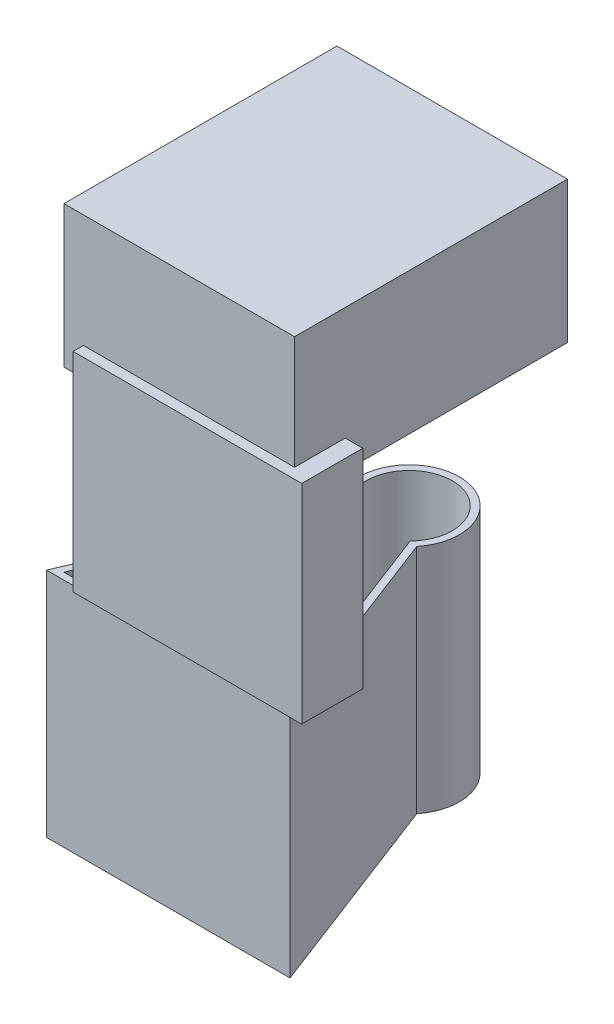
ISO-10303-21;
HEADER;
FILE_DESCRIPTION(('STEP AP214'),'2;1');
FILE_NAME('part.step','',(''),(''),'','','');
FILE_SCHEMA(('AUTOMOTIVE_DESIGN { 1 0 10303 214 1 1 1 1 }'));
ENDSEC;
DATA;
#1=APPLICATION_CONTEXT('core data for automotive mechanical design processes');
#2=APPLICATION_PROTOCOL_DEFINITION('international standard','automotive_design',2000,#1);
#3=PRODUCT_CONTEXT('',#1,'mechanical');
#4=PRODUCT('Part','Part','',(#3));
#5=PRODUCT_RELATED_PRODUCT_CATEGORY('part','',(#4));
#6=PRODUCT_DEFINITION_FORMATION('','',#4);
#7=PRODUCT_DEFINITION_CONTEXT('part definition',#1,'design');
#8=PRODUCT_DEFINITION('design','',#6,#7);
#9=PRODUCT_DEFINITION_SHAPE('','',#8);
#10=(LENGTH_UNIT() NAMED_UNIT(*) SI_UNIT(.MILLI.,.METRE.));
#11=(NAMED_UNIT(*) PLANE_ANGLE_UNIT() SI_UNIT($,.RADIAN.));
#12=(NAMED_UNIT(*) SI_UNIT($,.STERADIAN.) SOLID_ANGLE_UNIT());
#13=UNCERTAINTY_MEASURE_WITH_UNIT(LENGTH_MEASURE(1.E-05),#10,'distance_accuracy_value','');
#14=(GEOMETRIC_REPRESENTATION_CONTEXT(3) GLOBAL_UNCERTAINTY_ASSIGNED_CONTEXT((#13)) GLOBAL_UNIT_ASSIGNED_CONTEXT((#10,
#11,#12)) REPRESENTATION_CONTEXT('',''));
#15=CARTESIAN_POINT('',(0.,0.,0.));
#16=DIRECTION('',(0.,0.,1.));
#17=DIRECTION('',(1.,0.,0.));
#18=AXIS2_PLACEMENT_3D('',#15,#16,#17);
#19=CARTESIAN_POINT('',(-4.95391724093577,84.6392011698009,-49.3310687734821));
#20=DIRECTION('',(0.,-1.,0.));
#21=DIRECTION('',(0.,0.,-1.));
#22=AXIS2_PLACEMENT_3D('',#19,#20,#21);
#23=PLANE('',#22);
#24=DIRECTION('',(1.,0.,0.));
#25=VECTOR('',#24,1.);
#26=CARTESIAN_POINT('',(-4.95391724093577,84.6392011698009,37.3619784885693));
#27=LINE('',#26,#25);
#28=CARTESIAN_POINT('',(-50.8757468461296,84.6392011698009,37.3619784885693));
#29=VERTEX_POINT('',#28);
#30=CARTESIAN_POINT('',(-39.9174700103799,84.6392011698009,37.3619784885693));
#31=VERTEX_POINT('',#30);
#32=EDGE_CURVE('E359',#29,#31,#27,.T.);
#33=ORIENTED_EDGE('',*,*,#32,.T.);
#34=DIRECTION('',(0.,0.,-1.));
#35=VECTOR('',#34,1.);
#36=CARTESIAN_POINT('',(-39.9174700103799,84.6392011698009,-49.3310687734821));
#37=LINE('',#36,#35);
#38=CARTESIAN_POINT('',(-39.9174700103799,84.6392011698009,34.8219784885693));
#39=VERTEX_POINT('',#38);
#40=EDGE_CURVE('E299',#31,#39,#37,.T.);
#41=ORIENTED_EDGE('',*,*,#40,.T.);
#42=DIRECTION('',(1.,0.,0.));
#43=VECTOR('',#42,1.);
#44=CARTESIAN_POINT('',(-47.0317721679365,84.6392011698009,34.8219784885693));
#45=LINE('',#44,#43);
#46=CARTESIAN_POINT('',(-47.0317721679365,84.6392011698009,34.8219784885693));
#47=VERTEX_POINT('',#46);
#48=EDGE_CURVE('E393',#47,#39,#45,.T.);
#49=ORIENTED_EDGE('',*,*,#48,.F.);
#50=DIRECTION('',(-0.392153889503199,0.,0.919899628735392));
#51=VECTOR('',#50,1.);
#52=CARTESIAN_POINT('',(-15.9828122331645,84.6392011698009,-38.011486845156));
#53=LINE('',#52,#51);
#54=CARTESIAN_POINT('',(-39.9174700103799,84.6392011698009,18.1335199812764));
#55=VERTEX_POINT('',#54);
#56=EDGE_CURVE('E432',#55,#47,#53,.T.);
#57=ORIENTED_EDGE('',*,*,#56,.F.);
#58=CARTESIAN_POINT('',(-39.9174700103799,84.6392011698009,16.302076599942));
#59=VERTEX_POINT('',#58);
#60=EDGE_CURVE('E303',#55,#59,#37,.T.);
#61=ORIENTED_EDGE('',*,*,#60,.T.);
#62=DIRECTION('',(1.,0.,0.));
#63=VECTOR('',#62,1.);
#64=CARTESIAN_POINT('',(-4.95391724093577,84.6392011698009,16.302076599942));
#65=LINE('',#64,#63);
#66=CARTESIAN_POINT('',(-39.136724347527,84.6392011698009,16.302076599942));
#67=VERTEX_POINT('',#66);
#68=EDGE_CURVE('E309',#59,#67,#65,.T.);
#69=ORIENTED_EDGE('',*,*,#68,.T.);
#70=CARTESIAN_POINT('',(-15.9828122331645,84.6392011698009,-38.011486845156));
#71=VERTEX_POINT('',#70);
#72=EDGE_CURVE('E367',#71,#67,#53,.T.);
#73=ORIENTED_EDGE('',*,*,#72,.F.);
#74=CARTESIAN_POINT('',(-4.95391724093577,84.6392011698009,-49.3310687734821));
#75=DIRECTION('',(0.,1.,0.));
#76=DIRECTION('',(0.,0.,-1.));
#77=AXIS2_PLACEMENT_3D('',#74,#75,#76);
#78=CIRCLE('',#77,15.8040962975329);
#79=CARTESIAN_POINT('',(6.40171575912086,84.6392011698009,-38.339296443702));
#80=VERTEX_POINT('',#79);
#81=EDGE_CURVE('E333',#80,#71,#78,.T.);
#82=ORIENTED_EDGE('',*,*,#81,.F.);
#83=DIRECTION('',(-0.358251499245831,0.,-0.933625119246539));
#84=VECTOR('',#83,1.);
#85=CARTESIAN_POINT('',(34.4752282331372,84.6392011698009,34.8219784885693));
#86=LINE('',#85,#84);
#87=CARTESIAN_POINT('',(27.3687542526161,84.6392011698009,16.302076599942));
#88=VERTEX_POINT('',#87);
#89=EDGE_CURVE('E396',#88,#80,#86,.T.);
#90=ORIENTED_EDGE('',*,*,#89,.F.);
#91=CARTESIAN_POINT('',(30.0893322958138,84.6392011698009,16.302076599942));
#92=VERTEX_POINT('',#91);
#93=EDGE_CURVE('E313',#88,#92,#65,.T.);
#94=ORIENTED_EDGE('',*,*,#93,.T.);
#95=DIRECTION('',(-0.358251499245831,0.,-0.933625119246539));
#96=VECTOR('',#95,1.);
#97=CARTESIAN_POINT('',(3.63924799229749,84.6392011698009,-52.628446130421));
#98=LINE('',#97,#96);
#99=CARTESIAN_POINT('',(9.32395183839091,84.6392011698009,-37.8137633799985));
#100=VERTEX_POINT('',#99);
#101=EDGE_CURVE('E355',#92,#100,#98,.T.);
#102=ORIENTED_EDGE('',*,*,#101,.T.);
#103=CARTESIAN_POINT('',(-4.95391724093576,84.6392011698009,-49.3310687734812));
#104=DIRECTION('',(0.,-1.,0.));
#105=DIRECTION('',(0.,0.,-1.));
#106=AXIS2_PLACEMENT_3D('',#103,#104,#105);
#107=CIRCLE('',#106,18.3440962975323);
#108=CARTESIAN_POINT('',(-18.965674377796,84.6392011698009,-37.491451764862));
#109=VERTEX_POINT('',#108);
#110=EDGE_CURVE('E350',#100,#109,#107,.F.);
#111=ORIENTED_EDGE('',*,*,#110,.T.);
#112=DIRECTION('',(-0.392153889503199,0.,0.919899628735392));
#113=VECTOR('',#112,1.);
#114=CARTESIAN_POINT('',(-12.5398311952169,84.6392011698009,-52.5649494814214));
#115=LINE('',#114,#113);
#116=EDGE_CURVE('E356',#109,#29,#115,.T.);
#117=ORIENTED_EDGE('',*,*,#116,.T.);
#118=EDGE_LOOP('',(#33,#41,#49,#57,#61,#69,#73,#82,#90,#94,#102,#111,#117));
#119=FACE_BOUND('',#118,.T.);
#120=ADVANCED_FACE('F48',(#119),#23,.F.);
#121=CARTESIAN_POINT('',(-4.95391724093576,0.,-49.3310687734812));
#122=DIRECTION('',(0.,-1.,0.));
#123=DIRECTION('',(0.,0.,-1.));
#124=AXIS2_PLACEMENT_3D('',#121,#122,#123);
#125=PLANE('',#124);
#126=CARTESIAN_POINT('',(-4.95391724093576,0.,-49.3310687734812));
#127=DIRECTION('',(0.,1.,0.));
#128=DIRECTION('',(0.,0.,-1.));
#129=AXIS2_PLACEMENT_3D('',#126,#127,#128);
#130=CIRCLE('',#129,15.8040962975323);
#131=CARTESIAN_POINT('',(6.40171575912086,0.,-38.339296443702));
#132=VERTEX_POINT('',#131);
#133=CARTESIAN_POINT('',(-15.9828122331645,0.,-38.011486845156));
#134=VERTEX_POINT('',#133);
#135=EDGE_CURVE('E318',#132,#134,#130,.T.);
#136=ORIENTED_EDGE('',*,*,#135,.T.);
#137=DIRECTION('',(-0.392153889503199,0.,0.919899628735392));
#138=VECTOR('',#137,1.);
#139=CARTESIAN_POINT('',(-15.9828122331645,0.,-38.011486845156));
#140=LINE('',#139,#138);
#141=CARTESIAN_POINT('',(-47.0317721679365,0.,34.8219784885693));
#142=VERTEX_POINT('',#141);
#143=EDGE_CURVE('E322',#134,#142,#140,.T.);
#144=ORIENTED_EDGE('',*,*,#143,.T.);
#145=DIRECTION('',(1.,0.,0.));
#146=VECTOR('',#145,1.);
#147=CARTESIAN_POINT('',(-47.0317721679365,0.,34.8219784885693));
#148=LINE('',#147,#146);
#149=CARTESIAN_POINT('',(34.4752282331372,0.,34.8219784885693));
#150=VERTEX_POINT('',#149);
#151=EDGE_CURVE('E375',#142,#150,#148,.T.);
#152=ORIENTED_EDGE('',*,*,#151,.T.);
#153=DIRECTION('',(-0.358251499245831,0.,-0.933625119246539));
#154=VECTOR('',#153,1.);
#155=CARTESIAN_POINT('',(34.4752282331372,0.,34.8219784885693));
#156=LINE('',#155,#154);
#157=EDGE_CURVE('E380',#150,#132,#156,.T.);
#158=ORIENTED_EDGE('',*,*,#157,.T.);
#159=EDGE_LOOP('',(#136,#144,#152,#158));
#160=FACE_BOUND('',#159,.T.);
#161=CARTESIAN_POINT('',(-4.95391724093576,0.,-49.3310687734812));
#162=DIRECTION('',(0.,-1.,0.));
#163=DIRECTION('',(0.,0.,-1.));
#164=AXIS2_PLACEMENT_3D('',#161,#162,#163);
#165=CIRCLE('',#164,18.3440962975323);
#166=CARTESIAN_POINT('',(9.32395183839091,0.,-37.8137633799985));
#167=VERTEX_POINT('',#166);
#168=CARTESIAN_POINT('',(-18.965674377796,0.,-37.491451764862));
#169=VERTEX_POINT('',#168);
#170=EDGE_CURVE('E363',#167,#169,#165,.F.);
#171=ORIENTED_EDGE('',*,*,#170,.F.);
#172=DIRECTION('',(-0.358251499245831,0.,-0.933625119246539));
#173=VECTOR('',#172,1.);
#174=CARTESIAN_POINT('',(3.63924799229779,0.,-52.6284461304202));
#175=LINE('',#174,#173);
#176=CARTESIAN_POINT('',(38.1704574391258,0.,37.3619784885693));
#177=VERTEX_POINT('',#176);
#178=EDGE_CURVE('E366',#177,#167,#175,.T.);
#179=ORIENTED_EDGE('',*,*,#178,.F.);
#180=DIRECTION('',(1.,0.,0.));
#181=VECTOR('',#180,1.);
#182=CARTESIAN_POINT('',(-4.95391724093576,0.,37.3619784885693));
#183=LINE('',#182,#181);
#184=CARTESIAN_POINT('',(-50.8757468461296,0.,37.3619784885693));
#185=VERTEX_POINT('',#184);
#186=EDGE_CURVE('E369',#185,#177,#183,.T.);
#187=ORIENTED_EDGE('',*,*,#186,.F.);
#188=DIRECTION('',(-0.392153889503199,0.,0.919899628735392));
#189=VECTOR('',#188,1.);
#190=CARTESIAN_POINT('',(-12.5398311952173,0.,-52.5649494814207));
#191=LINE('',#190,#189);
#192=EDGE_CURVE('E343',#169,#185,#191,.T.);
#193=ORIENTED_EDGE('',*,*,#192,.F.);
#194=EDGE_LOOP('',(#171,#179,#187,#193));
#195=FACE_BOUND('',#194,.T.);
#196=ADVANCED_FACE('F457',(#160,#195),#125,.T.);
#197=CARTESIAN_POINT('',(-4.95391724093576,0.,-49.3310687734812));
#198=DIRECTION('',(0.,1.,0.));
#199=DIRECTION('',(0.,0.,1.));
#200=AXIS2_PLACEMENT_3D('',#197,#198,#199);
#201=CYLINDRICAL_SURFACE('',#200,18.3440962975323);
#202=DIRECTION('',(0.,1.,0.));
#203=VECTOR('',#202,1.);
#204=CARTESIAN_POINT('',(-18.965674377796,0.,-37.491451764862));
#205=LINE('',#204,#203);
#206=EDGE_CURVE('E340',#169,#109,#205,.T.);
#207=ORIENTED_EDGE('',*,*,#206,.T.);
#208=ORIENTED_EDGE('',*,*,#110,.F.);
#209=DIRECTION('',(0.,1.,0.));
#210=VECTOR('',#209,1.);
#211=CARTESIAN_POINT('',(9.32395183839091,0.,-37.8137633799985));
#212=LINE('',#211,#210);
#213=EDGE_CURVE('E342',#167,#100,#212,.T.);
#214=ORIENTED_EDGE('',*,*,#213,.F.);
#215=ORIENTED_EDGE('',*,*,#170,.T.);
#216=EDGE_LOOP('',(#207,#208,#214,#215));
#217=FACE_BOUND('',#216,.T.);
#218=ADVANCED_FACE('F493',(#217),#201,.T.);
#219=CARTESIAN_POINT('',(20.7749449934221,0.,-7.97178121840763));
#220=DIRECTION('',(-0.933625119246539,0.,0.358251499245831));
#221=DIRECTION('',(0.358251499245831,0.,0.933625119246539));
#222=AXIS2_PLACEMENT_3D('',#219,#220,#221);
#223=PLANE('',#222);
#224=ORIENTED_EDGE('',*,*,#101,.F.);
#225=DIRECTION('',(0.,-1.,0.));
#226=VECTOR('',#225,1.);
#227=CARTESIAN_POINT('',(30.0893322958138,0.,16.302076599942));
#228=LINE('',#227,#226);
#229=CARTESIAN_POINT('',(30.0893322958138,83.8,16.302076599942));
#230=VERTEX_POINT('',#229);
#231=EDGE_CURVE('E315',#92,#230,#228,.T.);
#232=ORIENTED_EDGE('',*,*,#231,.T.);
#233=DIRECTION('',(-0.358251499245831,0.,-0.933625119246539));
#234=VECTOR('',#233,1.);
#235=CARTESIAN_POINT('',(20.7749449934221,83.8,-7.97178121840763));
#236=LINE('',#235,#234);
#237=CARTESIAN_POINT('',(38.1704574391258,83.8,37.3619784885693));
#238=VERTEX_POINT('',#237);
#239=EDGE_CURVE('E297',#238,#230,#236,.T.);
#240=ORIENTED_EDGE('',*,*,#239,.F.);
#241=DIRECTION('',(0.,1.,0.));
#242=VECTOR('',#241,1.);
#243=CARTESIAN_POINT('',(38.1704574391258,0.,37.3619784885693));
#244=LINE('',#243,#242);
#245=EDGE_CURVE('E347',#177,#238,#244,.T.);
#246=ORIENTED_EDGE('',*,*,#245,.F.);
#247=ORIENTED_EDGE('',*,*,#178,.T.);
#248=ORIENTED_EDGE('',*,*,#213,.T.);
#249=EDGE_LOOP('',(#224,#232,#240,#246,#247,#248));
#250=FACE_BOUND('',#249,.T.);
#251=ADVANCED_FACE('F473',(#250),#223,.F.);
#252=CARTESIAN_POINT('',(-29.573793786131,0.,-12.6073300807178));
#253=DIRECTION('',(0.919899628735392,0.,0.392153889503199));
#254=DIRECTION('',(0.392153889503199,0.,-0.919899628735392));
#255=AXIS2_PLACEMENT_3D('',#252,#253,#254);
#256=PLANE('',#255);
#257=DIRECTION('',(0.,1.,0.));
#258=VECTOR('',#257,1.);
#259=CARTESIAN_POINT('',(-50.8757468461296,0.,37.3619784885693));
#260=LINE('',#259,#258);
#261=EDGE_CURVE('E346',#185,#29,#260,.T.);
#262=ORIENTED_EDGE('',*,*,#261,.T.);
#263=ORIENTED_EDGE('',*,*,#116,.F.);
#264=ORIENTED_EDGE('',*,*,#206,.F.);
#265=ORIENTED_EDGE('',*,*,#192,.T.);
#266=EDGE_LOOP('',(#262,#263,#264,#265));
#267=FACE_BOUND('',#266,.T.);
#268=ADVANCED_FACE('F486',(#267),#256,.F.);
#269=CARTESIAN_POINT('',(0.,0.,37.3619784885693));
#270=DIRECTION('',(0.,0.,-1.));
#271=DIRECTION('',(-1.,0.,0.));
#272=AXIS2_PLACEMENT_3D('',#269,#270,#271);
#273=PLANE('',#272);
#274=DIRECTION('',(1.,0.,0.));
#275=VECTOR('',#274,1.);
#276=CARTESIAN_POINT('',(0.,83.8,37.3619784885693));
#277=LINE('',#276,#275);
#278=CARTESIAN_POINT('',(-39.9174700103799,83.8,37.3619784885693));
#279=VERTEX_POINT('',#278);
#280=EDGE_CURVE('E295',#279,#238,#277,.T.);
#281=ORIENTED_EDGE('',*,*,#280,.F.);
#282=DIRECTION('',(0.,1.,0.));
#283=VECTOR('',#282,1.);
#284=CARTESIAN_POINT('',(-39.9174700103799,0.,37.3619784885693));
#285=LINE('',#284,#283);
#286=EDGE_CURVE('E302',#279,#31,#285,.T.);
#287=ORIENTED_EDGE('',*,*,#286,.T.);
#288=ORIENTED_EDGE('',*,*,#32,.F.);
#289=ORIENTED_EDGE('',*,*,#261,.F.);
#290=ORIENTED_EDGE('',*,*,#186,.T.);
#291=ORIENTED_EDGE('',*,*,#245,.T.);
#292=EDGE_LOOP('',(#281,#287,#288,#289,#290,#291));
#293=FACE_BOUND('',#292,.T.);
#294=ADVANCED_FACE('F50',(#293),#273,.F.);
#295=CARTESIAN_POINT('',(-4.95391724093576,0.,-49.3310687734812));
#296=DIRECTION('',(0.,1.,0.));
#297=DIRECTION('',(0.,0.,1.));
#298=AXIS2_PLACEMENT_3D('',#295,#296,#297);
#299=CYLINDRICAL_SURFACE('',#298,15.8040962975323);
#300=DIRECTION('',(0.,1.,0.));
#301=VECTOR('',#300,1.);
#302=CARTESIAN_POINT('',(-15.9828122331645,0.,-38.011486845156));
#303=LINE('',#302,#301);
#304=EDGE_CURVE('E319',#134,#71,#303,.T.);
#305=ORIENTED_EDGE('',*,*,#304,.F.);
#306=ORIENTED_EDGE('',*,*,#135,.F.);
#307=DIRECTION('',(0.,1.,0.));
#308=VECTOR('',#307,1.);
#309=CARTESIAN_POINT('',(6.40171575912086,0.,-38.339296443702));
#310=LINE('',#309,#308);
#311=EDGE_CURVE('E321',#132,#80,#310,.T.);
#312=ORIENTED_EDGE('',*,*,#311,.T.);
#313=ORIENTED_EDGE('',*,*,#81,.T.);
#314=EDGE_LOOP('',(#305,#306,#312,#313));
#315=FACE_BOUND('',#314,.T.);
#316=ADVANCED_FACE('F478',(#315),#299,.F.);
#317=CARTESIAN_POINT('',(18.4035371905359,0.,-7.06182241032322));
#318=DIRECTION('',(-0.933625119246539,0.,0.358251499245831));
#319=DIRECTION('',(0.358251499245831,0.,0.933625119246539));
#320=AXIS2_PLACEMENT_3D('',#317,#318,#319);
#321=PLANE('',#320);
#322=DIRECTION('',(0.,-1.,0.));
#323=VECTOR('',#322,1.);
#324=CARTESIAN_POINT('',(27.3687542526161,0.,16.302076599942));
#325=LINE('',#324,#323);
#326=CARTESIAN_POINT('',(27.3687542526161,83.8,16.302076599942));
#327=VERTEX_POINT('',#326);
#328=EDGE_CURVE('E312',#88,#327,#325,.T.);
#329=ORIENTED_EDGE('',*,*,#328,.F.);
#330=ORIENTED_EDGE('',*,*,#89,.T.);
#331=ORIENTED_EDGE('',*,*,#311,.F.);
#332=ORIENTED_EDGE('',*,*,#157,.F.);
#333=DIRECTION('',(0.,1.,0.));
#334=VECTOR('',#333,1.);
#335=CARTESIAN_POINT('',(34.4752282331372,0.,34.8219784885693));
#336=LINE('',#335,#334);
#337=CARTESIAN_POINT('',(34.4752282331372,83.8,34.8219784885693));
#338=VERTEX_POINT('',#337);
#339=EDGE_CURVE('E328',#150,#338,#336,.T.);
#340=ORIENTED_EDGE('',*,*,#339,.T.);
#341=DIRECTION('',(-0.358251499245831,0.,-0.933625119246539));
#342=VECTOR('',#341,1.);
#343=CARTESIAN_POINT('',(18.4035371905359,83.8,-7.06182241032322));
#344=LINE('',#343,#342);
#345=EDGE_CURVE('E283',#338,#327,#344,.T.);
#346=ORIENTED_EDGE('',*,*,#345,.T.);
#347=EDGE_LOOP('',(#329,#330,#331,#332,#340,#346));
#348=FACE_BOUND('',#347,.T.);
#349=ADVANCED_FACE('F454',(#348),#321,.T.);
#350=CARTESIAN_POINT('',(-27.2372487291431,0.,-11.6112592013797));
#351=DIRECTION('',(0.919899628735392,0.,0.392153889503199));
#352=DIRECTION('',(0.392153889503199,0.,-0.919899628735392));
#353=AXIS2_PLACEMENT_3D('',#350,#351,#352);
#354=PLANE('',#353);
#355=DIRECTION('',(0.,-1.,0.));
#356=VECTOR('',#355,1.);
#357=CARTESIAN_POINT('',(-39.9174700103799,0.,18.1335199812764));
#358=LINE('',#357,#356);
#359=CARTESIAN_POINT('',(-39.9174700103799,83.8,18.1335199812764));
#360=VERTEX_POINT('',#359);
#361=EDGE_CURVE('E306',#55,#360,#358,.T.);
#362=ORIENTED_EDGE('',*,*,#361,.F.);
#363=ORIENTED_EDGE('',*,*,#56,.T.);
#364=DIRECTION('',(0.,1.,0.));
#365=VECTOR('',#364,1.);
#366=CARTESIAN_POINT('',(-47.0317721679365,0.,34.8219784885693));
#367=LINE('',#366,#365);
#368=EDGE_CURVE('E325',#142,#47,#367,.T.);
#369=ORIENTED_EDGE('',*,*,#368,.F.);
#370=ORIENTED_EDGE('',*,*,#143,.F.);
#371=ORIENTED_EDGE('',*,*,#304,.T.);
#372=ORIENTED_EDGE('',*,*,#72,.T.);
#373=DIRECTION('',(0.,1.,0.));
#374=VECTOR('',#373,1.);
#375=CARTESIAN_POINT('',(-39.136724347527,0.,16.302076599942));
#376=LINE('',#375,#374);
#377=CARTESIAN_POINT('',(-39.136724347527,83.8,16.302076599942));
#378=VERTEX_POINT('',#377);
#379=EDGE_CURVE('E399',#378,#67,#376,.T.);
#380=ORIENTED_EDGE('',*,*,#379,.F.);
#381=DIRECTION('',(-0.392153889503199,0.,0.919899628735392));
#382=VECTOR('',#381,1.);
#383=CARTESIAN_POINT('',(-27.2372487291431,83.8,-11.6112592013797));
#384=LINE('',#383,#382);
#385=EDGE_CURVE('E292',#378,#360,#384,.T.);
#386=ORIENTED_EDGE('',*,*,#385,.T.);
#387=EDGE_LOOP('',(#362,#363,#369,#370,#371,#372,#380,#386));
#388=FACE_BOUND('',#387,.T.);
#389=ADVANCED_FACE('F429',(#388),#354,.T.);
#390=CARTESIAN_POINT('',(0.,0.,34.8219784885693));
#391=DIRECTION('',(0.,0.,-1.));
#392=DIRECTION('',(-1.,0.,0.));
#393=AXIS2_PLACEMENT_3D('',#390,#391,#392);
#394=PLANE('',#393);
#395=DIRECTION('',(0.,1.,0.));
#396=VECTOR('',#395,1.);
#397=CARTESIAN_POINT('',(-39.9174700103799,0.,34.8219784885693));
#398=LINE('',#397,#396);
#399=CARTESIAN_POINT('',(-39.9174700103799,83.8,34.8219784885693));
#400=VERTEX_POINT('',#399);
#401=EDGE_CURVE('E441',#400,#39,#398,.T.);
#402=ORIENTED_EDGE('',*,*,#401,.F.);
#403=DIRECTION('',(1.,0.,0.));
#404=VECTOR('',#403,1.);
#405=CARTESIAN_POINT('',(0.,83.8,34.8219784885693));
#406=LINE('',#405,#404);
#407=EDGE_CURVE('E358',#400,#338,#406,.T.);
#408=ORIENTED_EDGE('',*,*,#407,.T.);
#409=ORIENTED_EDGE('',*,*,#339,.F.);
#410=ORIENTED_EDGE('',*,*,#151,.F.);
#411=ORIENTED_EDGE('',*,*,#368,.T.);
#412=ORIENTED_EDGE('',*,*,#48,.T.);
#413=EDGE_LOOP('',(#402,#408,#409,#410,#411,#412));
#414=FACE_BOUND('',#413,.T.);
#415=ADVANCED_FACE('F447',(#414),#394,.T.);
#416=CARTESIAN_POINT('',(-39.9174700103799,83.8,16.302076599942));
#417=DIRECTION('',(0.,0.,-1.));
#418=DIRECTION('',(-1.,0.,0.));
#419=AXIS2_PLACEMENT_3D('',#416,#417,#418);
#420=PLANE('',#419);
#421=DIRECTION('',(0.,-1.,0.));
#422=VECTOR('',#421,1.);
#423=CARTESIAN_POINT('',(37.2726754082449,83.8,16.302076599942));
#424=LINE('',#423,#422);
#425=CARTESIAN_POINT('',(37.2726754082449,160.,16.302076599942));
#426=VERTEX_POINT('',#425);
#427=CARTESIAN_POINT('',(37.2726754082449,149.586,16.302076599942));
#428=VERTEX_POINT('',#427);
#429=EDGE_CURVE('E253',#426,#428,#424,.T.);
#430=ORIENTED_EDGE('',*,*,#429,.F.);
#431=DIRECTION('',(-1.,0.,0.));
#432=VECTOR('',#431,1.);
#433=CARTESIAN_POINT('',(-39.9174700103799,160.,16.302076599942));
#434=LINE('',#433,#432);
#435=CARTESIAN_POINT('',(43.7068019371623,160.,16.302076599942));
#436=VERTEX_POINT('',#435);
#437=EDGE_CURVE('E260',#436,#426,#434,.T.);
#438=ORIENTED_EDGE('',*,*,#437,.F.);
#439=DIRECTION('',(0.,1.,0.));
#440=VECTOR('',#439,1.);
#441=CARTESIAN_POINT('',(43.7068019371623,83.8,16.302076599942));
#442=LINE('',#441,#440);
#443=CARTESIAN_POINT('',(43.7068019371623,83.8,16.302076599942));
#444=VERTEX_POINT('',#443);
#445=EDGE_CURVE('E284',#444,#436,#442,.T.);
#446=ORIENTED_EDGE('',*,*,#445,.F.);
#447=DIRECTION('',(-1.,0.,0.));
#448=VECTOR('',#447,1.);
#449=CARTESIAN_POINT('',(-39.9174700103799,83.8,16.302076599942));
#450=LINE('',#449,#448);
#451=EDGE_CURVE('E268',#444,#230,#450,.T.);
#452=ORIENTED_EDGE('',*,*,#451,.T.);
#453=ORIENTED_EDGE('',*,*,#231,.F.);
#454=ORIENTED_EDGE('',*,*,#93,.F.);
#455=ORIENTED_EDGE('',*,*,#328,.T.);
#456=EDGE_CURVE('E267',#327,#378,#450,.T.);
#457=ORIENTED_EDGE('',*,*,#456,.T.);
#458=ORIENTED_EDGE('',*,*,#379,.T.);
#459=ORIENTED_EDGE('',*,*,#68,.F.);
#460=DIRECTION('',(0.,1.,0.));
#461=VECTOR('',#460,1.);
#462=CARTESIAN_POINT('',(-39.9174700103799,83.8,16.302076599942));
#463=LINE('',#462,#461);
#464=CARTESIAN_POINT('',(-39.9174700103799,149.586,16.302076599942));
#465=VERTEX_POINT('',#464);
#466=EDGE_CURVE('E281',#59,#465,#463,.T.);
#467=ORIENTED_EDGE('',*,*,#466,.T.);
#468=DIRECTION('',(-1.,0.,0.));
#469=VECTOR('',#468,1.);
#470=CARTESIAN_POINT('',(-39.9174700103799,149.586,16.302076599942));
#471=LINE('',#470,#469);
#472=EDGE_CURVE('E63',#428,#465,#471,.T.);
#473=ORIENTED_EDGE('',*,*,#472,.F.);
#474=EDGE_LOOP('',(#430,#438,#446,#452,#453,#454,#455,#457,#458,#459,#467,#473));
#475=FACE_BOUND('',#474,.T.);
#476=ADVANCED_FACE('F419',(#475),#420,.T.);
#477=CARTESIAN_POINT('',(-39.9174700103799,83.8,16.302076599942));
#478=DIRECTION('',(-1.,0.,0.));
#479=DIRECTION('',(0.,0.,1.));
#480=AXIS2_PLACEMENT_3D('',#477,#478,#479);
#481=PLANE('',#480);
#482=DIRECTION('',(0.,1.,0.));
#483=VECTOR('',#482,1.);
#484=CARTESIAN_POINT('',(-39.9174700103799,83.8,34.8219784885693));
#485=LINE('',#484,#483);
#486=CARTESIAN_POINT('',(-39.9174700103799,149.586,34.8219784885693));
#487=VERTEX_POINT('',#486);
#488=CARTESIAN_POINT('',(-39.9174700103799,160.,34.8219784885693));
#489=VERTEX_POINT('',#488);
#490=EDGE_CURVE('E71',#487,#489,#485,.T.);
#491=ORIENTED_EDGE('',*,*,#490,.F.);
#492=DIRECTION('',(0.,0.,1.));
#493=VECTOR('',#492,1.);
#494=CARTESIAN_POINT('',(-39.9174700103799,149.586,16.302076599942));
#495=LINE('',#494,#493);
#496=EDGE_CURVE('E12',#465,#487,#495,.T.);
#497=ORIENTED_EDGE('',*,*,#496,.F.);
#498=ORIENTED_EDGE('',*,*,#466,.F.);
#499=ORIENTED_EDGE('',*,*,#60,.F.);
#500=ORIENTED_EDGE('',*,*,#361,.T.);
#501=DIRECTION('',(0.,0.,1.));
#502=VECTOR('',#501,1.);
#503=CARTESIAN_POINT('',(-39.9174700103799,83.8,16.302076599942));
#504=LINE('',#503,#502);
#505=EDGE_CURVE('E259',#360,#400,#504,.T.);
#506=ORIENTED_EDGE('',*,*,#505,.T.);
#507=ORIENTED_EDGE('',*,*,#401,.T.);
#508=ORIENTED_EDGE('',*,*,#40,.F.);
#509=ORIENTED_EDGE('',*,*,#286,.F.);
#510=CARTESIAN_POINT('',(-39.9174700103799,83.8,38.6135284127533));
#511=VERTEX_POINT('',#510);
#512=EDGE_CURVE('E257',#279,#511,#504,.T.);
#513=ORIENTED_EDGE('',*,*,#512,.T.);
#514=DIRECTION('',(0.,1.,0.));
#515=VECTOR('',#514,1.);
#516=CARTESIAN_POINT('',(-39.9174700103799,83.8,38.6135284127533));
#517=LINE('',#516,#515);
#518=CARTESIAN_POINT('',(-39.9174700103799,160.,38.6135284127533));
#519=VERTEX_POINT('',#518);
#520=EDGE_CURVE('E271',#511,#519,#517,.T.);
#521=ORIENTED_EDGE('',*,*,#520,.T.);
#522=DIRECTION('',(0.,0.,1.));
#523=VECTOR('',#522,1.);
#524=CARTESIAN_POINT('',(-39.9174700103799,160.,16.302076599942));
#525=LINE('',#524,#523);
#526=EDGE_CURVE('E256',#489,#519,#525,.T.);
#527=ORIENTED_EDGE('',*,*,#526,.F.);
#528=EDGE_LOOP('',(#491,#497,#498,#499,#500,#506,#507,#508,#509,#513,#521,#527));
#529=FACE_BOUND('',#528,.T.);
#530=ADVANCED_FACE('F417',(#529),#481,.T.);
#531=CARTESIAN_POINT('',(0.,83.8,0.));
#532=DIRECTION('',(0.,1.,0.));
#533=DIRECTION('',(0.,0.,1.));
#534=AXIS2_PLACEMENT_3D('',#531,#532,#533);
#535=PLANE('',#534);
#536=ORIENTED_EDGE('',*,*,#280,.T.);
#537=ORIENTED_EDGE('',*,*,#239,.T.);
#538=ORIENTED_EDGE('',*,*,#451,.F.);
#539=DIRECTION('',(0.,0.,-1.));
#540=VECTOR('',#539,1.);
#541=CARTESIAN_POINT('',(43.7068019371623,83.8,16.302076599942));
#542=LINE('',#541,#540);
#543=CARTESIAN_POINT('',(43.7068019371623,83.8,38.6135284127533));
#544=VERTEX_POINT('',#543);
#545=EDGE_CURVE('E264',#544,#444,#542,.T.);
#546=ORIENTED_EDGE('',*,*,#545,.F.);
#547=DIRECTION('',(1.,0.,0.));
#548=VECTOR('',#547,1.);
#549=CARTESIAN_POINT('',(-39.9174700103799,83.8,38.6135284127533));
#550=LINE('',#549,#548);
#551=EDGE_CURVE('E261',#511,#544,#550,.T.);
#552=ORIENTED_EDGE('',*,*,#551,.F.);
#553=ORIENTED_EDGE('',*,*,#512,.F.);
#554=EDGE_LOOP('',(#536,#537,#538,#546,#552,#553));
#555=FACE_BOUND('',#554,.T.);
#556=ADVANCED_FACE('F468',(#555),#535,.F.);
#557=CARTESIAN_POINT('',(43.7068019371623,83.8,16.302076599942));
#558=DIRECTION('',(1.,0.,0.));
#559=DIRECTION('',(0.,0.,-1.));
#560=AXIS2_PLACEMENT_3D('',#557,#558,#559);
#561=PLANE('',#560);
#562=DIRECTION('',(0.,0.,-1.));
#563=VECTOR('',#562,1.);
#564=CARTESIAN_POINT('',(43.7068019371623,160.,16.302076599942));
#565=LINE('',#564,#563);
#566=CARTESIAN_POINT('',(43.7068019371623,160.,38.6135284127533));
#567=VERTEX_POINT('',#566);
#568=EDGE_CURVE('E276',#567,#436,#565,.T.);
#569=ORIENTED_EDGE('',*,*,#568,.F.);
#570=DIRECTION('',(0.,1.,0.));
#571=VECTOR('',#570,1.);
#572=CARTESIAN_POINT('',(43.7068019371623,83.8,38.6135284127533));
#573=LINE('',#572,#571);
#574=EDGE_CURVE('E286',#544,#567,#573,.T.);
#575=ORIENTED_EDGE('',*,*,#574,.F.);
#576=ORIENTED_EDGE('',*,*,#545,.T.);
#577=ORIENTED_EDGE('',*,*,#445,.T.);
#578=EDGE_LOOP('',(#569,#575,#576,#577));
#579=FACE_BOUND('',#578,.T.);
#580=ADVANCED_FACE('F568',(#579),#561,.T.);
#581=CARTESIAN_POINT('',(-39.9174700103799,83.8,38.6135284127533));
#582=DIRECTION('',(0.,0.,1.));
#583=DIRECTION('',(1.,0.,0.));
#584=AXIS2_PLACEMENT_3D('',#581,#582,#583);
#585=PLANE('',#584);
#586=DIRECTION('',(1.,0.,0.));
#587=VECTOR('',#586,1.);
#588=CARTESIAN_POINT('',(-39.9174700103799,160.,38.6135284127533));
#589=LINE('',#588,#587);
#590=EDGE_CURVE('E273',#519,#567,#589,.T.);
#591=ORIENTED_EDGE('',*,*,#590,.F.);
#592=ORIENTED_EDGE('',*,*,#520,.F.);
#593=ORIENTED_EDGE('',*,*,#551,.T.);
#594=ORIENTED_EDGE('',*,*,#574,.T.);
#595=EDGE_LOOP('',(#591,#592,#593,#594));
#596=FACE_BOUND('',#595,.T.);
#597=ADVANCED_FACE('F578',(#596),#585,.T.);
#598=ORIENTED_EDGE('',*,*,#385,.F.);
#599=ORIENTED_EDGE('',*,*,#456,.F.);
#600=ORIENTED_EDGE('',*,*,#345,.F.);
#601=ORIENTED_EDGE('',*,*,#407,.F.);
#602=ORIENTED_EDGE('',*,*,#505,.F.);
#603=EDGE_LOOP('',(#598,#599,#600,#601,#602));
#604=FACE_BOUND('',#603,.T.);
#605=ADVANCED_FACE('F570',(#604),#535,.F.);
#606=CARTESIAN_POINT('',(0.,160.,0.));
#607=DIRECTION('',(0.,1.,0.));
#608=DIRECTION('',(0.,0.,1.));
#609=AXIS2_PLACEMENT_3D('',#606,#607,#608);
#610=PLANE('',#609);
#611=DIRECTION('',(0.,0.,-1.));
#612=VECTOR('',#611,1.);
#613=CARTESIAN_POINT('',(37.2726754082449,160.,0.));
#614=LINE('',#613,#612);
#615=CARTESIAN_POINT('',(37.2726754082449,160.,34.8219784885693));
#616=VERTEX_POINT('',#615);
#617=EDGE_CURVE('E56',#616,#426,#614,.T.);
#618=ORIENTED_EDGE('',*,*,#617,.F.);
#619=DIRECTION('',(1.,0.,0.));
#620=VECTOR('',#619,1.);
#621=CARTESIAN_POINT('',(0.,160.,34.8219784885693));
#622=LINE('',#621,#620);
#623=EDGE_CURVE('E401',#489,#616,#622,.T.);
#624=ORIENTED_EDGE('',*,*,#623,.F.);
#625=ORIENTED_EDGE('',*,*,#526,.T.);
#626=ORIENTED_EDGE('',*,*,#590,.T.);
#627=ORIENTED_EDGE('',*,*,#568,.T.);
#628=ORIENTED_EDGE('',*,*,#437,.T.);
#629=EDGE_LOOP('',(#618,#624,#625,#626,#627,#628));
#630=FACE_BOUND('',#629,.T.);
#631=ADVANCED_FACE('F409',(#630),#610,.T.);
#632=CARTESIAN_POINT('',(-47.0317721679365,149.586,34.8219784885693));
#633=DIRECTION('',(1.,0.,0.));
#634=DIRECTION('',(0.,0.,-1.));
#635=AXIS2_PLACEMENT_3D('',#632,#633,#634);
#636=PLANE('',#635);
#637=DIRECTION('',(0.,1.,0.));
#638=VECTOR('',#637,1.);
#639=CARTESIAN_POINT('',(-47.0317721679365,149.586,34.8219784885693));
#640=LINE('',#639,#638);
#641=CARTESIAN_POINT('',(-47.0317721679365,149.586,34.8219784885693));
#642=VERTEX_POINT('',#641);
#643=CARTESIAN_POINT('',(-47.0317721679365,201.359307983315,34.8219784885693));
#644=VERTEX_POINT('',#643);
#645=EDGE_CURVE('E233',#642,#644,#640,.T.);
#646=ORIENTED_EDGE('',*,*,#645,.T.);
#647=DIRECTION('',(0.,0.,-1.));
#648=VECTOR('',#647,1.);
#649=CARTESIAN_POINT('',(-47.0317721679365,201.359307983315,34.8219784885693));
#650=LINE('',#649,#648);
#651=CARTESIAN_POINT('',(-47.0317721679365,201.359307983315,-64.9884504105529));
#652=VERTEX_POINT('',#651);
#653=EDGE_CURVE('E228',#644,#652,#650,.T.);
#654=ORIENTED_EDGE('',*,*,#653,.T.);
#655=DIRECTION('',(0.,1.,0.));
#656=VECTOR('',#655,1.);
#657=CARTESIAN_POINT('',(-47.0317721679365,149.586,-64.9884504105529));
#658=LINE('',#657,#656);
#659=CARTESIAN_POINT('',(-47.0317721679365,149.586,-64.9884504105529));
#660=VERTEX_POINT('',#659);
#661=EDGE_CURVE('E210',#660,#652,#658,.T.);
#662=ORIENTED_EDGE('',*,*,#661,.F.);
#663=DIRECTION('',(0.,0.,-1.));
#664=VECTOR('',#663,1.);
#665=CARTESIAN_POINT('',(-47.0317721679365,149.586,34.8219784885693));
#666=LINE('',#665,#664);
#667=EDGE_CURVE('E240',#642,#660,#666,.T.);
#668=ORIENTED_EDGE('',*,*,#667,.F.);
#669=EDGE_LOOP('',(#646,#654,#662,#668));
#670=FACE_BOUND('',#669,.T.);
#671=ADVANCED_FACE('F232',(#670),#636,.F.);
#672=CARTESIAN_POINT('',(-47.0317721679365,149.586,-64.9884504105529));
#673=DIRECTION('',(0.,0.,1.));
#674=DIRECTION('',(1.,0.,0.));
#675=AXIS2_PLACEMENT_3D('',#672,#673,#674);
#676=PLANE('',#675);
#677=ORIENTED_EDGE('',*,*,#661,.T.);
#678=DIRECTION('',(1.,0.,0.));
#679=VECTOR('',#678,1.);
#680=CARTESIAN_POINT('',(-47.0317721679365,201.359307983315,-64.9884504105529));
#681=LINE('',#680,#679);
#682=CARTESIAN_POINT('',(37.2726754082449,201.359307983315,-64.9884504105529));
#683=VERTEX_POINT('',#682);
#684=EDGE_CURVE('E214',#652,#683,#681,.T.);
#685=ORIENTED_EDGE('',*,*,#684,.T.);
#686=DIRECTION('',(0.,1.,0.));
#687=VECTOR('',#686,1.);
#688=CARTESIAN_POINT('',(37.2726754082449,149.586,-64.9884504105529));
#689=LINE('',#688,#687);
#690=CARTESIAN_POINT('',(37.2726754082449,149.586,-64.9884504105529));
#691=VERTEX_POINT('',#690);
#692=EDGE_CURVE('E221',#691,#683,#689,.T.);
#693=ORIENTED_EDGE('',*,*,#692,.F.);
#694=DIRECTION('',(1.,0.,0.));
#695=VECTOR('',#694,1.);
#696=CARTESIAN_POINT('',(-47.0317721679365,149.586,-64.9884504105529));
#697=LINE('',#696,#695);
#698=EDGE_CURVE('E216',#660,#691,#697,.T.);
#699=ORIENTED_EDGE('',*,*,#698,.F.);
#700=EDGE_LOOP('',(#677,#685,#693,#699));
#701=FACE_BOUND('',#700,.T.);
#702=ADVANCED_FACE('F212',(#701),#676,.F.);
#703=CARTESIAN_POINT('',(37.2726754082449,149.586,34.8219784885693));
#704=DIRECTION('',(1.,0.,0.));
#705=DIRECTION('',(0.,0.,-1.));
#706=AXIS2_PLACEMENT_3D('',#703,#704,#705);
#707=PLANE('',#706);
#708=ORIENTED_EDGE('',*,*,#617,.T.);
#709=ORIENTED_EDGE('',*,*,#429,.T.);
#710=DIRECTION('',(0.,0.,-1.));
#711=VECTOR('',#710,1.);
#712=CARTESIAN_POINT('',(37.2726754082449,149.586,34.8219784885693));
#713=LINE('',#712,#711);
#714=EDGE_CURVE('E243',#428,#691,#713,.T.);
#715=ORIENTED_EDGE('',*,*,#714,.T.);
#716=ORIENTED_EDGE('',*,*,#692,.T.);
#717=DIRECTION('',(0.,0.,-1.));
#718=VECTOR('',#717,1.);
#719=CARTESIAN_POINT('',(37.2726754082449,201.359307983315,34.8219784885693));
#720=LINE('',#719,#718);
#721=CARTESIAN_POINT('',(37.2726754082449,201.359307983315,34.8219784885693));
#722=VERTEX_POINT('',#721);
#723=EDGE_CURVE('E230',#722,#683,#720,.T.);
#724=ORIENTED_EDGE('',*,*,#723,.F.);
#725=DIRECTION('',(0.,1.,0.));
#726=VECTOR('',#725,1.);
#727=CARTESIAN_POINT('',(37.2726754082449,149.586,34.8219784885693));
#728=LINE('',#727,#726);
#729=EDGE_CURVE('E249',#616,#722,#728,.T.);
#730=ORIENTED_EDGE('',*,*,#729,.F.);
#731=EDGE_LOOP('',(#708,#709,#715,#716,#724,#730));
#732=FACE_BOUND('',#731,.T.);
#733=ADVANCED_FACE('F406',(#732),#707,.T.);
#734=CARTESIAN_POINT('',(-47.0317721679365,149.586,34.8219784885693));
#735=DIRECTION('',(0.,0.,1.));
#736=DIRECTION('',(1.,0.,0.));
#737=AXIS2_PLACEMENT_3D('',#734,#735,#736);
#738=PLANE('',#737);
#739=DIRECTION('',(1.,0.,0.));
#740=VECTOR('',#739,1.);
#741=CARTESIAN_POINT('',(-47.0317721679365,149.586,34.8219784885693));
#742=LINE('',#741,#740);
#743=EDGE_CURVE('E245',#642,#487,#742,.T.);
#744=ORIENTED_EDGE('',*,*,#743,.T.);
#745=ORIENTED_EDGE('',*,*,#490,.T.);
#746=ORIENTED_EDGE('',*,*,#623,.T.);
#747=ORIENTED_EDGE('',*,*,#729,.T.);
#748=DIRECTION('',(1.,0.,0.));
#749=VECTOR('',#748,1.);
#750=CARTESIAN_POINT('',(-47.0317721679365,201.359307983315,34.8219784885693));
#751=LINE('',#750,#749);
#752=EDGE_CURVE('E238',#644,#722,#751,.T.);
#753=ORIENTED_EDGE('',*,*,#752,.F.);
#754=ORIENTED_EDGE('',*,*,#645,.F.);
#755=EDGE_LOOP('',(#744,#745,#746,#747,#753,#754));
#756=FACE_BOUND('',#755,.T.);
#757=ADVANCED_FACE('F412',(#756),#738,.T.);
#758=CARTESIAN_POINT('',(0.,149.586,0.));
#759=DIRECTION('',(0.,-1.,0.));
#760=DIRECTION('',(0.,0.,-1.));
#761=AXIS2_PLACEMENT_3D('',#758,#759,#760);
#762=PLANE('',#761);
#763=ORIENTED_EDGE('',*,*,#714,.F.);
#764=ORIENTED_EDGE('',*,*,#472,.T.);
#765=ORIENTED_EDGE('',*,*,#496,.T.);
#766=ORIENTED_EDGE('',*,*,#743,.F.);
#767=ORIENTED_EDGE('',*,*,#667,.T.);
#768=ORIENTED_EDGE('',*,*,#698,.T.);
#769=EDGE_LOOP('',(#763,#764,#765,#766,#767,#768));
#770=FACE_BOUND('',#769,.T.);
#771=ADVANCED_FACE('F415',(#770),#762,.T.);
#772=CARTESIAN_POINT('',(0.,201.359307983315,0.));
#773=DIRECTION('',(0.,-1.,0.));
#774=DIRECTION('',(0.,0.,-1.));
#775=AXIS2_PLACEMENT_3D('',#772,#773,#774);
#776=PLANE('',#775);
#777=ORIENTED_EDGE('',*,*,#653,.F.);
#778=ORIENTED_EDGE('',*,*,#752,.T.);
#779=ORIENTED_EDGE('',*,*,#723,.T.);
#780=ORIENTED_EDGE('',*,*,#684,.F.);
#781=EDGE_LOOP('',(#777,#778,#779,#780));
#782=FACE_BOUND('',#781,.T.);
#783=ADVANCED_FACE('F226',(#782),#776,.F.);
#784=CLOSED_SHELL('',(#120,#196,#218,#251,#268,#294,#316,#349,#389,#415,#476,#530,#556,#580,
#597,#605,#631,#671,#702,#733,#757,#771,#783));
#785=MANIFOLD_SOLID_BREP('B2',#784);
#786=ADVANCED_BREP_SHAPE_REPRESENTATION('',(#18,#785),#14);
#787=SHAPE_DEFINITION_REPRESENTATION(#9,#786);
ENDSEC;
END-ISO-10303-21;
